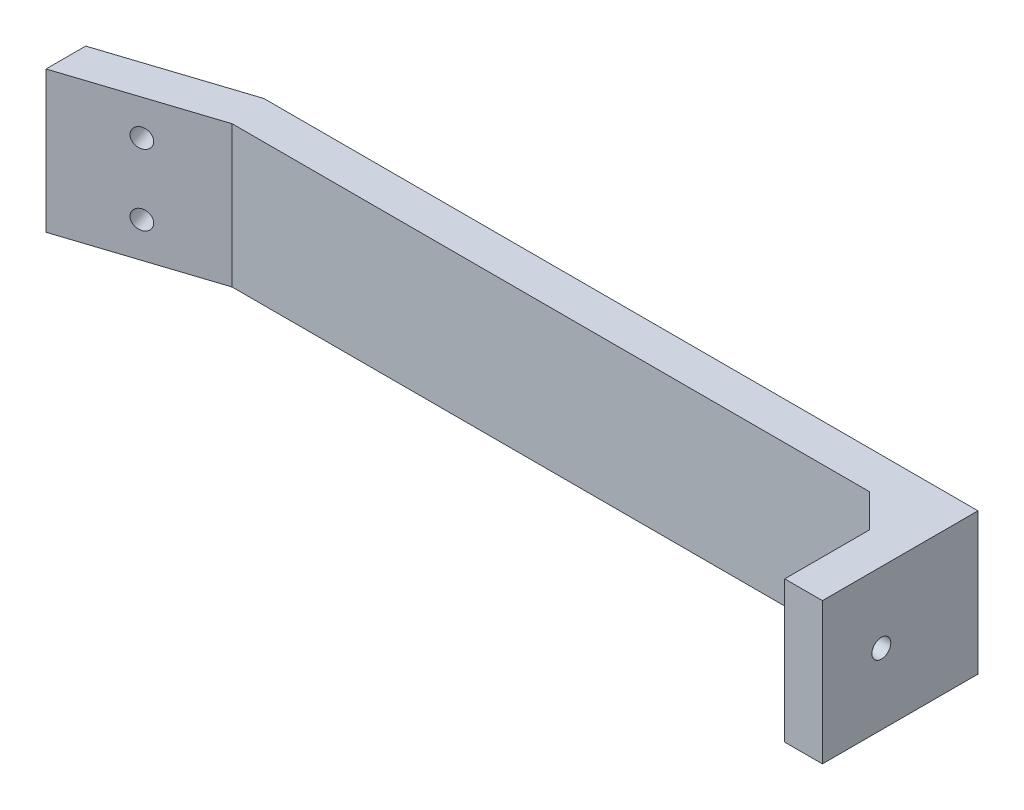
ISO-10303-21;
HEADER;
FILE_DESCRIPTION(('STEP AP214'),'2;1');
FILE_NAME('part.step','',(''),(''),'','','');
FILE_SCHEMA(('AUTOMOTIVE_DESIGN { 1 0 10303 214 1 1 1 1 }'));
ENDSEC;
DATA;
#1=APPLICATION_CONTEXT('core data for automotive mechanical design processes');
#2=APPLICATION_PROTOCOL_DEFINITION('international standard','automotive_design',2000,#1);
#3=PRODUCT_CONTEXT('',#1,'mechanical');
#4=PRODUCT('Part','Part','',(#3));
#5=PRODUCT_RELATED_PRODUCT_CATEGORY('part','',(#4));
#6=PRODUCT_DEFINITION_FORMATION('','',#4);
#7=PRODUCT_DEFINITION_CONTEXT('part definition',#1,'design');
#8=PRODUCT_DEFINITION('design','',#6,#7);
#9=PRODUCT_DEFINITION_SHAPE('','',#8);
#10=(LENGTH_UNIT() NAMED_UNIT(*) SI_UNIT(.MILLI.,.METRE.));
#11=(NAMED_UNIT(*) PLANE_ANGLE_UNIT() SI_UNIT($,.RADIAN.));
#12=(NAMED_UNIT(*) SI_UNIT($,.STERADIAN.) SOLID_ANGLE_UNIT());
#13=UNCERTAINTY_MEASURE_WITH_UNIT(LENGTH_MEASURE(1.E-05),#10,'distance_accuracy_value','');
#14=(GEOMETRIC_REPRESENTATION_CONTEXT(3) GLOBAL_UNCERTAINTY_ASSIGNED_CONTEXT((#13)) GLOBAL_UNIT_ASSIGNED_CONTEXT((#10,
#11,#12)) REPRESENTATION_CONTEXT('',''));
#15=CARTESIAN_POINT('',(0.,0.,0.));
#16=DIRECTION('',(0.,0.,1.));
#17=DIRECTION('',(1.,0.,0.));
#18=AXIS2_PLACEMENT_3D('',#15,#16,#17);
#19=CARTESIAN_POINT('',(90.,15.,8.00000000000001));
#20=DIRECTION('',(0.,0.,-1.));
#21=DIRECTION('',(-1.,0.,0.));
#22=AXIS2_PLACEMENT_3D('',#19,#20,#21);
#23=PLANE('',#22);
#24=DIRECTION('',(1.,0.,0.));
#25=VECTOR('',#24,1.);
#26=CARTESIAN_POINT('',(75.,10.,8.00000000000001));
#27=LINE('',#26,#25);
#28=CARTESIAN_POINT('',(75.,10.,8.00000000000001));
#29=VERTEX_POINT('',#28);
#30=CARTESIAN_POINT('',(82.,10.,7.99999999999999));
#31=VERTEX_POINT('',#30);
#32=EDGE_CURVE('E215',#29,#31,#27,.T.);
#33=ORIENTED_EDGE('',*,*,#32,.F.);
#34=DIRECTION('',(0.,-1.,0.));
#35=VECTOR('',#34,1.);
#36=CARTESIAN_POINT('',(75.,15.,8.00000000000001));
#37=LINE('',#36,#35);
#38=CARTESIAN_POINT('',(75.,15.,8.00000000000001));
#39=VERTEX_POINT('',#38);
#40=EDGE_CURVE('E127',#39,#29,#37,.T.);
#41=ORIENTED_EDGE('',*,*,#40,.F.);
#42=DIRECTION('',(1.,0.,0.));
#43=VECTOR('',#42,1.);
#44=CARTESIAN_POINT('',(90.,15.,8.00000000000001));
#45=LINE('',#44,#43);
#46=CARTESIAN_POINT('',(-60.201228988549,15.,7.99999999999999));
#47=VERTEX_POINT('',#46);
#48=EDGE_CURVE('E138',#47,#39,#45,.T.);
#49=ORIENTED_EDGE('',*,*,#48,.F.);
#50=DIRECTION('',(0.,-1.,0.));
#51=VECTOR('',#50,1.);
#52=CARTESIAN_POINT('',(-60.201228988549,15.,7.99999999999999));
#53=LINE('',#52,#51);
#54=CARTESIAN_POINT('',(-60.201228988549,-15.,7.99999999999999));
#55=VERTEX_POINT('',#54);
#56=EDGE_CURVE('E162',#47,#55,#53,.T.);
#57=ORIENTED_EDGE('',*,*,#56,.T.);
#58=DIRECTION('',(1.,0.,0.));
#59=VECTOR('',#58,1.);
#60=CARTESIAN_POINT('',(90.,-15.,8.00000000000001));
#61=LINE('',#60,#59);
#62=CARTESIAN_POINT('',(75.,-15.,8.00000000000001));
#63=VERTEX_POINT('',#62);
#64=EDGE_CURVE('E149',#55,#63,#61,.T.);
#65=ORIENTED_EDGE('',*,*,#64,.T.);
#66=DIRECTION('',(0.,-1.,0.));
#67=VECTOR('',#66,1.);
#68=CARTESIAN_POINT('',(75.,-15.,8.00000000000001));
#69=LINE('',#68,#67);
#70=CARTESIAN_POINT('',(75.,-10.,8.00000000000001));
#71=VERTEX_POINT('',#70);
#72=EDGE_CURVE('E220',#71,#63,#69,.T.);
#73=ORIENTED_EDGE('',*,*,#72,.F.);
#74=DIRECTION('',(1.,0.,0.));
#75=VECTOR('',#74,1.);
#76=CARTESIAN_POINT('',(75.,-9.99999999999999,8.00000000000001));
#77=LINE('',#76,#75);
#78=CARTESIAN_POINT('',(82.,-9.99999999999999,8.00000000000001));
#79=VERTEX_POINT('',#78);
#80=EDGE_CURVE('E222',#71,#79,#77,.T.);
#81=ORIENTED_EDGE('',*,*,#80,.T.);
#82=DIRECTION('',(0.,-1.,0.));
#83=VECTOR('',#82,1.);
#84=CARTESIAN_POINT('',(82.,15.,7.99999999999999));
#85=LINE('',#84,#83);
#86=EDGE_CURVE('E229',#31,#79,#85,.T.);
#87=ORIENTED_EDGE('',*,*,#86,.F.);
#88=EDGE_LOOP('',(#33,#41,#49,#57,#65,#73,#81,#87));
#89=FACE_BOUND('',#88,.T.);
#90=ADVANCED_FACE('F34',(#89),#23,.F.);
#91=CARTESIAN_POINT('',(82.,15.,33.));
#92=DIRECTION('',(1.,0.,0.));
#93=DIRECTION('',(0.,0.,-1.));
#94=AXIS2_PLACEMENT_3D('',#91,#92,#93);
#95=PLANE('',#94);
#96=CARTESIAN_POINT('',(82.,0.,20.5));
#97=DIRECTION('',(-1.,0.,0.));
#98=DIRECTION('',(0.,0.,1.));
#99=AXIS2_PLACEMENT_3D('',#96,#97,#98);
#100=CIRCLE('',#99,2.);
#101=CARTESIAN_POINT('',(82.,0.,22.5));
#102=VERTEX_POINT('',#101);
#103=EDGE_CURVE('E192',#102,#102,#100,.T.);
#104=ORIENTED_EDGE('',*,*,#103,.F.);
#105=EDGE_LOOP('',(#104));
#106=FACE_BOUND('',#105,.T.);
#107=DIRECTION('',(0.,0.,-1.));
#108=VECTOR('',#107,1.);
#109=CARTESIAN_POINT('',(82.,-9.99999999999999,8.00000000000001));
#110=LINE('',#109,#108);
#111=CARTESIAN_POINT('',(82.,-9.99999999999999,15.));
#112=VERTEX_POINT('',#111);
#113=EDGE_CURVE('E223',#112,#79,#110,.T.);
#114=ORIENTED_EDGE('',*,*,#113,.F.);
#115=DIRECTION('',(0.,1.,0.));
#116=VECTOR('',#115,1.);
#117=CARTESIAN_POINT('',(82.,-15.,15.));
#118=LINE('',#117,#116);
#119=CARTESIAN_POINT('',(82.,-15.,15.));
#120=VERTEX_POINT('',#119);
#121=EDGE_CURVE('E219',#120,#112,#118,.T.);
#122=ORIENTED_EDGE('',*,*,#121,.F.);
#123=DIRECTION('',(0.,0.,-1.));
#124=VECTOR('',#123,1.);
#125=CARTESIAN_POINT('',(82.,-15.,33.));
#126=LINE('',#125,#124);
#127=CARTESIAN_POINT('',(82.,-15.,33.));
#128=VERTEX_POINT('',#127);
#129=EDGE_CURVE('E146',#128,#120,#126,.T.);
#130=ORIENTED_EDGE('',*,*,#129,.F.);
#131=DIRECTION('',(0.,-1.,0.));
#132=VECTOR('',#131,1.);
#133=CARTESIAN_POINT('',(82.,15.,33.));
#134=LINE('',#133,#132);
#135=CARTESIAN_POINT('',(82.,15.,33.));
#136=VERTEX_POINT('',#135);
#137=EDGE_CURVE('E144',#136,#128,#134,.T.);
#138=ORIENTED_EDGE('',*,*,#137,.F.);
#139=DIRECTION('',(0.,0.,-1.));
#140=VECTOR('',#139,1.);
#141=CARTESIAN_POINT('',(82.,15.,33.));
#142=LINE('',#141,#140);
#143=CARTESIAN_POINT('',(82.,15.,15.));
#144=VERTEX_POINT('',#143);
#145=EDGE_CURVE('E134',#136,#144,#142,.T.);
#146=ORIENTED_EDGE('',*,*,#145,.T.);
#147=DIRECTION('',(0.,1.,0.));
#148=VECTOR('',#147,1.);
#149=CARTESIAN_POINT('',(82.,15.,15.));
#150=LINE('',#149,#148);
#151=CARTESIAN_POINT('',(82.,10.,15.));
#152=VERTEX_POINT('',#151);
#153=EDGE_CURVE('E122',#152,#144,#150,.T.);
#154=ORIENTED_EDGE('',*,*,#153,.F.);
#155=DIRECTION('',(0.,0.,1.));
#156=VECTOR('',#155,1.);
#157=CARTESIAN_POINT('',(82.,10.,8.00000000000001));
#158=LINE('',#157,#156);
#159=EDGE_CURVE('E51',#31,#152,#158,.T.);
#160=ORIENTED_EDGE('',*,*,#159,.F.);
#161=ORIENTED_EDGE('',*,*,#86,.T.);
#162=EDGE_LOOP('',(#114,#122,#130,#138,#146,#154,#160,#161));
#163=FACE_BOUND('',#162,.T.);
#164=ADVANCED_FACE('F142',(#106,#163),#95,.F.);
#165=CARTESIAN_POINT('',(90.,15.,50.));
#166=DIRECTION('',(-1.,0.,0.));
#167=DIRECTION('',(0.,-1.,0.));
#168=AXIS2_PLACEMENT_3D('',#165,#166,#167);
#169=PLANE('',#168);
#170=CARTESIAN_POINT('',(90.,0.,20.5));
#171=DIRECTION('',(-1.,0.,0.));
#172=DIRECTION('',(0.,-1.,0.));
#173=AXIS2_PLACEMENT_3D('',#170,#171,#172);
#174=CIRCLE('',#173,2.);
#175=CARTESIAN_POINT('',(90.,-2.,20.5));
#176=VERTEX_POINT('',#175);
#177=EDGE_CURVE('E190',#176,#176,#174,.T.);
#178=ORIENTED_EDGE('',*,*,#177,.T.);
#179=EDGE_LOOP('',(#178));
#180=FACE_BOUND('',#179,.T.);
#181=DIRECTION('',(0.,0.,-1.));
#182=VECTOR('',#181,1.);
#183=CARTESIAN_POINT('',(90.,15.,50.));
#184=LINE('',#183,#182);
#185=CARTESIAN_POINT('',(90.,15.,33.));
#186=VERTEX_POINT('',#185);
#187=CARTESIAN_POINT('',(90.,15.,0.));
#188=VERTEX_POINT('',#187);
#189=EDGE_CURVE('E11',#186,#188,#184,.T.);
#190=ORIENTED_EDGE('',*,*,#189,.F.);
#191=DIRECTION('',(0.,1.,0.));
#192=VECTOR('',#191,1.);
#193=CARTESIAN_POINT('',(90.,15.,33.));
#194=LINE('',#193,#192);
#195=CARTESIAN_POINT('',(90.,-15.,33.));
#196=VERTEX_POINT('',#195);
#197=EDGE_CURVE('E230',#196,#186,#194,.T.);
#198=ORIENTED_EDGE('',*,*,#197,.F.);
#199=DIRECTION('',(0.,0.,-1.));
#200=VECTOR('',#199,1.);
#201=CARTESIAN_POINT('',(90.,-15.,50.));
#202=LINE('',#201,#200);
#203=CARTESIAN_POINT('',(90.,-15.,0.));
#204=VERTEX_POINT('',#203);
#205=EDGE_CURVE('E185',#196,#204,#202,.T.);
#206=ORIENTED_EDGE('',*,*,#205,.T.);
#207=DIRECTION('',(0.,1.,0.));
#208=VECTOR('',#207,1.);
#209=CARTESIAN_POINT('',(90.,15.,0.));
#210=LINE('',#209,#208);
#211=EDGE_CURVE('E175',#204,#188,#210,.T.);
#212=ORIENTED_EDGE('',*,*,#211,.T.);
#213=EDGE_LOOP('',(#190,#198,#206,#212));
#214=FACE_BOUND('',#213,.T.);
#215=ADVANCED_FACE('F36',(#180,#214),#169,.F.);
#216=CARTESIAN_POINT('',(-90.,15.,50.));
#217=DIRECTION('',(0.,-1.,0.));
#218=DIRECTION('',(1.,0.,0.));
#219=AXIS2_PLACEMENT_3D('',#216,#217,#218);
#220=PLANE('',#219);
#221=ORIENTED_EDGE('',*,*,#48,.T.);
#222=DIRECTION('',(0.707106781186548,0.,0.707106781186547));
#223=VECTOR('',#222,1.);
#224=CARTESIAN_POINT('',(75.,15.,8.00000000000001));
#225=LINE('',#224,#223);
#226=EDGE_CURVE('E59',#39,#144,#225,.T.);
#227=ORIENTED_EDGE('',*,*,#226,.T.);
#228=ORIENTED_EDGE('',*,*,#145,.F.);
#229=DIRECTION('',(-1.,0.,0.));
#230=VECTOR('',#229,1.);
#231=CARTESIAN_POINT('',(90.,15.,33.));
#232=LINE('',#231,#230);
#233=EDGE_CURVE('E233',#186,#136,#232,.T.);
#234=ORIENTED_EDGE('',*,*,#233,.F.);
#235=ORIENTED_EDGE('',*,*,#189,.T.);
#236=DIRECTION('',(-1.,0.,0.));
#237=VECTOR('',#236,1.);
#238=CARTESIAN_POINT('',(-90.,15.,0.));
#239=LINE('',#238,#237);
#240=CARTESIAN_POINT('',(-61.4683045111454,15.,0.));
#241=VERTEX_POINT('',#240);
#242=EDGE_CURVE('E179',#188,#241,#239,.T.);
#243=ORIENTED_EDGE('',*,*,#242,.T.);
#244=DIRECTION('',(-0.951056516295153,0.,0.309016994374949));
#245=VECTOR('',#244,1.);
#246=CARTESIAN_POINT('',(-90.,15.,9.27050983124847));
#247=LINE('',#246,#245);
#248=CARTESIAN_POINT('',(-90.,15.,9.27050983124847));
#249=VERTEX_POINT('',#248);
#250=EDGE_CURVE('E166',#241,#249,#247,.T.);
#251=ORIENTED_EDGE('',*,*,#250,.T.);
#252=DIRECTION('',(0.,0.,-1.));
#253=VECTOR('',#252,1.);
#254=CARTESIAN_POINT('',(-90.,15.,50.));
#255=LINE('',#254,#253);
#256=CARTESIAN_POINT('',(-90.,15.,17.6822076251546));
#257=VERTEX_POINT('',#256);
#258=EDGE_CURVE('E43',#257,#249,#255,.T.);
#259=ORIENTED_EDGE('',*,*,#258,.F.);
#260=DIRECTION('',(0.951056516295153,0.,-0.309016994374949));
#261=VECTOR('',#260,1.);
#262=CARTESIAN_POINT('',(-90.,15.,17.6822076251546));
#263=LINE('',#262,#261);
#264=EDGE_CURVE('E156',#257,#47,#263,.T.);
#265=ORIENTED_EDGE('',*,*,#264,.T.);
#266=EDGE_LOOP('',(#221,#227,#228,#234,#235,#243,#251,#259,#265));
#267=FACE_BOUND('',#266,.T.);
#268=ADVANCED_FACE('F132',(#267),#220,.F.);
#269=CARTESIAN_POINT('',(-90.,15.,50.));
#270=DIRECTION('',(1.,0.,0.));
#271=DIRECTION('',(0.,1.,0.));
#272=AXIS2_PLACEMENT_3D('',#269,#270,#271);
#273=PLANE('',#272);
#274=DIRECTION('',(0.,0.,-1.));
#275=VECTOR('',#274,1.);
#276=CARTESIAN_POINT('',(-90.,-15.,50.));
#277=LINE('',#276,#275);
#278=CARTESIAN_POINT('',(-90.,-15.,17.6822076251546));
#279=VERTEX_POINT('',#278);
#280=CARTESIAN_POINT('',(-90.,-15.,9.27050983124847));
#281=VERTEX_POINT('',#280);
#282=EDGE_CURVE('E187',#279,#281,#277,.T.);
#283=ORIENTED_EDGE('',*,*,#282,.F.);
#284=DIRECTION('',(0.,-1.,0.));
#285=VECTOR('',#284,1.);
#286=CARTESIAN_POINT('',(-90.,15.,17.6822076251546));
#287=LINE('',#286,#285);
#288=EDGE_CURVE('E158',#257,#279,#287,.T.);
#289=ORIENTED_EDGE('',*,*,#288,.F.);
#290=ORIENTED_EDGE('',*,*,#258,.T.);
#291=DIRECTION('',(0.,-1.,0.));
#292=VECTOR('',#291,1.);
#293=CARTESIAN_POINT('',(-90.,15.,9.27050983124847));
#294=LINE('',#293,#292);
#295=EDGE_CURVE('E172',#249,#281,#294,.T.);
#296=ORIENTED_EDGE('',*,*,#295,.T.);
#297=EDGE_LOOP('',(#283,#289,#290,#296));
#298=FACE_BOUND('',#297,.T.);
#299=ADVANCED_FACE('F269',(#298),#273,.F.);
#300=CARTESIAN_POINT('',(-90.,-15.,50.));
#301=DIRECTION('',(0.,1.,0.));
#302=DIRECTION('',(0.,0.,1.));
#303=AXIS2_PLACEMENT_3D('',#300,#301,#302);
#304=PLANE('',#303);
#305=ORIENTED_EDGE('',*,*,#129,.T.);
#306=DIRECTION('',(0.707106781186548,0.,0.707106781186547));
#307=VECTOR('',#306,1.);
#308=CARTESIAN_POINT('',(75.,-15.,8.00000000000001));
#309=LINE('',#308,#307);
#310=EDGE_CURVE('E139',#63,#120,#309,.T.);
#311=ORIENTED_EDGE('',*,*,#310,.F.);
#312=ORIENTED_EDGE('',*,*,#64,.F.);
#313=DIRECTION('',(0.951056516295153,0.,-0.309016994374949));
#314=VECTOR('',#313,1.);
#315=CARTESIAN_POINT('',(-90.,-15.,17.6822076251546));
#316=LINE('',#315,#314);
#317=EDGE_CURVE('E145',#279,#55,#316,.T.);
#318=ORIENTED_EDGE('',*,*,#317,.F.);
#319=ORIENTED_EDGE('',*,*,#282,.T.);
#320=DIRECTION('',(-0.951056516295153,0.,0.309016994374949));
#321=VECTOR('',#320,1.);
#322=CARTESIAN_POINT('',(-90.,-15.,9.27050983124847));
#323=LINE('',#322,#321);
#324=CARTESIAN_POINT('',(-61.4683045111454,-15.,0.));
#325=VERTEX_POINT('',#324);
#326=EDGE_CURVE('E164',#325,#281,#323,.T.);
#327=ORIENTED_EDGE('',*,*,#326,.F.);
#328=DIRECTION('',(1.,0.,0.));
#329=VECTOR('',#328,1.);
#330=CARTESIAN_POINT('',(-90.,-15.,0.));
#331=LINE('',#330,#329);
#332=EDGE_CURVE('E182',#325,#204,#331,.T.);
#333=ORIENTED_EDGE('',*,*,#332,.T.);
#334=ORIENTED_EDGE('',*,*,#205,.F.);
#335=DIRECTION('',(1.,0.,0.));
#336=VECTOR('',#335,1.);
#337=CARTESIAN_POINT('',(90.,-15.,33.));
#338=LINE('',#337,#336);
#339=EDGE_CURVE('E152',#128,#196,#338,.T.);
#340=ORIENTED_EDGE('',*,*,#339,.F.);
#341=EDGE_LOOP('',(#305,#311,#312,#318,#319,#327,#333,#334,#340));
#342=FACE_BOUND('',#341,.T.);
#343=ADVANCED_FACE('F249',(#342),#304,.F.);
#344=CARTESIAN_POINT('',(0.,0.,0.));
#345=DIRECTION('',(0.,0.,1.));
#346=DIRECTION('',(1.,0.,0.));
#347=AXIS2_PLACEMENT_3D('',#344,#345,#346);
#348=PLANE('',#347);
#349=ORIENTED_EDGE('',*,*,#332,.F.);
#350=DIRECTION('',(0.,-1.,0.));
#351=VECTOR('',#350,1.);
#352=CARTESIAN_POINT('',(-61.4683045111454,15.,0.));
#353=LINE('',#352,#351);
#354=EDGE_CURVE('E169',#241,#325,#353,.T.);
#355=ORIENTED_EDGE('',*,*,#354,.F.);
#356=ORIENTED_EDGE('',*,*,#242,.F.);
#357=ORIENTED_EDGE('',*,*,#211,.F.);
#358=EDGE_LOOP('',(#349,#355,#356,#357));
#359=FACE_BOUND('',#358,.T.);
#360=ADVANCED_FACE('F260',(#359),#348,.F.);
#361=CARTESIAN_POINT('',(-90.,15.,9.27050983124847));
#362=DIRECTION('',(0.309016994374949,0.,0.951056516295153));
#363=DIRECTION('',(0.951056516295153,0.,-0.309016994374949));
#364=AXIS2_PLACEMENT_3D('',#361,#362,#363);
#365=PLANE('',#364);
#366=CARTESIAN_POINT('',(-77.1270322229585,7.5,5.08782905151615));
#367=DIRECTION('',(-0.309016994374949,0.,-0.951056516295153));
#368=DIRECTION('',(-0.951056516295153,0.,0.309016994374949));
#369=AXIS2_PLACEMENT_3D('',#366,#367,#368);
#370=CIRCLE('',#369,2.);
#371=CARTESIAN_POINT('',(-79.0291452555489,7.5,5.70586304026605));
#372=VERTEX_POINT('',#371);
#373=EDGE_CURVE('E195',#372,#372,#370,.T.);
#374=ORIENTED_EDGE('',*,*,#373,.F.);
#375=EDGE_LOOP('',(#374));
#376=FACE_BOUND('',#375,.T.);
#377=CARTESIAN_POINT('',(-77.1270322229585,-7.5,5.08782905151615));
#378=DIRECTION('',(-0.309016994374949,0.,-0.951056516295153));
#379=DIRECTION('',(-0.951056516295153,0.,0.309016994374949));
#380=AXIS2_PLACEMENT_3D('',#377,#378,#379);
#381=CIRCLE('',#380,2.);
#382=CARTESIAN_POINT('',(-79.0291452555489,-7.5,5.70586304026605));
#383=VERTEX_POINT('',#382);
#384=EDGE_CURVE('E200',#383,#383,#381,.T.);
#385=ORIENTED_EDGE('',*,*,#384,.F.);
#386=EDGE_LOOP('',(#385));
#387=FACE_BOUND('',#386,.T.);
#388=ORIENTED_EDGE('',*,*,#326,.T.);
#389=ORIENTED_EDGE('',*,*,#295,.F.);
#390=ORIENTED_EDGE('',*,*,#250,.F.);
#391=ORIENTED_EDGE('',*,*,#354,.T.);
#392=EDGE_LOOP('',(#388,#389,#390,#391));
#393=FACE_BOUND('',#392,.T.);
#394=ADVANCED_FACE('F263',(#376,#387,#393),#365,.F.);
#395=CARTESIAN_POINT('',(-90.,15.,17.6822076251546));
#396=DIRECTION('',(-0.309016994374949,0.,-0.951056516295153));
#397=DIRECTION('',(-0.951056516295153,0.,0.309016994374949));
#398=AXIS2_PLACEMENT_3D('',#395,#396,#397);
#399=PLANE('',#398);
#400=CARTESIAN_POINT('',(-74.654896267959,7.5,12.6962811818774));
#401=DIRECTION('',(-0.309016994374949,0.,-0.951056516295153));
#402=DIRECTION('',(-0.951056516295153,0.,0.309016994374949));
#403=AXIS2_PLACEMENT_3D('',#400,#401,#402);
#404=CIRCLE('',#403,2.);
#405=CARTESIAN_POINT('',(-76.5570093005493,7.5,13.3143151706273));
#406=VERTEX_POINT('',#405);
#407=EDGE_CURVE('E38',#406,#406,#404,.T.);
#408=ORIENTED_EDGE('',*,*,#407,.T.);
#409=EDGE_LOOP('',(#408));
#410=FACE_BOUND('',#409,.T.);
#411=CARTESIAN_POINT('',(-74.654896267959,-7.5,12.6962811818774));
#412=DIRECTION('',(-0.309016994374949,0.,-0.951056516295153));
#413=DIRECTION('',(-0.951056516295153,0.,0.309016994374949));
#414=AXIS2_PLACEMENT_3D('',#411,#412,#413);
#415=CIRCLE('',#414,2.);
#416=CARTESIAN_POINT('',(-76.5570093005493,-7.5,13.3143151706273));
#417=VERTEX_POINT('',#416);
#418=EDGE_CURVE('E193',#417,#417,#415,.T.);
#419=ORIENTED_EDGE('',*,*,#418,.T.);
#420=EDGE_LOOP('',(#419));
#421=FACE_BOUND('',#420,.T.);
#422=ORIENTED_EDGE('',*,*,#317,.T.);
#423=ORIENTED_EDGE('',*,*,#56,.F.);
#424=ORIENTED_EDGE('',*,*,#264,.F.);
#425=ORIENTED_EDGE('',*,*,#288,.T.);
#426=EDGE_LOOP('',(#422,#423,#424,#425));
#427=FACE_BOUND('',#426,.T.);
#428=ADVANCED_FACE('F272',(#410,#421,#427),#399,.F.);
#429=CARTESIAN_POINT('',(0.,0.,33.));
#430=DIRECTION('',(0.,0.,-1.));
#431=DIRECTION('',(-1.,0.,0.));
#432=AXIS2_PLACEMENT_3D('',#429,#430,#431);
#433=PLANE('',#432);
#434=ORIENTED_EDGE('',*,*,#197,.T.);
#435=ORIENTED_EDGE('',*,*,#233,.T.);
#436=ORIENTED_EDGE('',*,*,#137,.T.);
#437=ORIENTED_EDGE('',*,*,#339,.T.);
#438=EDGE_LOOP('',(#434,#435,#436,#437));
#439=FACE_BOUND('',#438,.T.);
#440=ADVANCED_FACE('F253',(#439),#433,.F.);
#441=CARTESIAN_POINT('',(75.,-9.99999999999999,8.00000000000001));
#442=DIRECTION('',(0.,-1.,0.));
#443=DIRECTION('',(0.,0.,-1.));
#444=AXIS2_PLACEMENT_3D('',#441,#442,#443);
#445=PLANE('',#444);
#446=ORIENTED_EDGE('',*,*,#80,.F.);
#447=DIRECTION('',(0.707106781186548,0.,0.707106781186547));
#448=VECTOR('',#447,1.);
#449=CARTESIAN_POINT('',(75.,-9.99999999999999,8.00000000000001));
#450=LINE('',#449,#448);
#451=EDGE_CURVE('E211',#71,#112,#450,.T.);
#452=ORIENTED_EDGE('',*,*,#451,.T.);
#453=ORIENTED_EDGE('',*,*,#113,.T.);
#454=EDGE_LOOP('',(#446,#452,#453));
#455=FACE_BOUND('',#454,.T.);
#456=ADVANCED_FACE('F243',(#455),#445,.F.);
#457=CARTESIAN_POINT('',(75.,10.,8.00000000000001));
#458=DIRECTION('',(0.,1.,0.));
#459=DIRECTION('',(0.,0.,1.));
#460=AXIS2_PLACEMENT_3D('',#457,#458,#459);
#461=PLANE('',#460);
#462=ORIENTED_EDGE('',*,*,#159,.T.);
#463=DIRECTION('',(-0.707106781186548,0.,-0.707106781186547));
#464=VECTOR('',#463,1.);
#465=CARTESIAN_POINT('',(75.,10.,8.00000000000001));
#466=LINE('',#465,#464);
#467=EDGE_CURVE('E125',#152,#29,#466,.T.);
#468=ORIENTED_EDGE('',*,*,#467,.T.);
#469=ORIENTED_EDGE('',*,*,#32,.T.);
#470=EDGE_LOOP('',(#462,#468,#469));
#471=FACE_BOUND('',#470,.T.);
#472=ADVANCED_FACE('F274',(#471),#461,.F.);
#473=CARTESIAN_POINT('',(75.,15.,8.00000000000001));
#474=DIRECTION('',(0.707106781186547,0.,-0.707106781186548));
#475=DIRECTION('',(-0.707106781186548,0.,-0.707106781186547));
#476=AXIS2_PLACEMENT_3D('',#473,#474,#475);
#477=PLANE('',#476);
#478=ORIENTED_EDGE('',*,*,#153,.T.);
#479=ORIENTED_EDGE('',*,*,#226,.F.);
#480=ORIENTED_EDGE('',*,*,#40,.T.);
#481=ORIENTED_EDGE('',*,*,#467,.F.);
#482=EDGE_LOOP('',(#478,#479,#480,#481));
#483=FACE_BOUND('',#482,.T.);
#484=ADVANCED_FACE('F123',(#483),#477,.F.);
#485=ORIENTED_EDGE('',*,*,#72,.T.);
#486=ORIENTED_EDGE('',*,*,#310,.T.);
#487=ORIENTED_EDGE('',*,*,#121,.T.);
#488=ORIENTED_EDGE('',*,*,#451,.F.);
#489=EDGE_LOOP('',(#485,#486,#487,#488));
#490=FACE_BOUND('',#489,.T.);
#491=ADVANCED_FACE('F245',(#490),#477,.F.);
#492=CARTESIAN_POINT('',(97.,0.,20.5));
#493=DIRECTION('',(-1.,0.,0.));
#494=DIRECTION('',(0.,0.,1.));
#495=AXIS2_PLACEMENT_3D('',#492,#493,#494);
#496=CYLINDRICAL_SURFACE('',#495,2.);
#497=ORIENTED_EDGE('',*,*,#103,.T.);
#498=EDGE_LOOP('',(#497));
#499=FACE_BOUND('',#498,.T.);
#500=ORIENTED_EDGE('',*,*,#177,.F.);
#501=EDGE_LOOP('',(#500));
#502=FACE_BOUND('',#501,.T.);
#503=ADVANCED_FACE('F312',(#499,#502),#496,.F.);
#504=CARTESIAN_POINT('',(-52.9646395338979,-7.5,79.4520272494013));
#505=DIRECTION('',(-0.309016994374949,0.,-0.951056516295153));
#506=DIRECTION('',(-0.951056516295153,0.,0.309016994374949));
#507=AXIS2_PLACEMENT_3D('',#504,#505,#506);
#508=CYLINDRICAL_SURFACE('',#507,2.);
#509=ORIENTED_EDGE('',*,*,#384,.T.);
#510=EDGE_LOOP('',(#509));
#511=FACE_BOUND('',#510,.T.);
#512=ORIENTED_EDGE('',*,*,#418,.F.);
#513=EDGE_LOOP('',(#512));
#514=FACE_BOUND('',#513,.T.);
#515=ADVANCED_FACE('F314',(#511,#514),#508,.F.);
#516=CARTESIAN_POINT('',(-52.9646395338979,7.5,79.4520272494013));
#517=DIRECTION('',(-0.309016994374949,0.,-0.951056516295153));
#518=DIRECTION('',(-0.951056516295153,0.,0.309016994374949));
#519=AXIS2_PLACEMENT_3D('',#516,#517,#518);
#520=CYLINDRICAL_SURFACE('',#519,2.);
#521=ORIENTED_EDGE('',*,*,#373,.T.);
#522=EDGE_LOOP('',(#521));
#523=FACE_BOUND('',#522,.T.);
#524=ORIENTED_EDGE('',*,*,#407,.F.);
#525=EDGE_LOOP('',(#524));
#526=FACE_BOUND('',#525,.T.);
#527=ADVANCED_FACE('F321',(#523,#526),#520,.F.);
#528=CLOSED_SHELL('',(#90,#164,#215,#268,#299,#343,#360,#394,#428,#440,#456,#472,#484,#491,#503,
#515,#527));
#529=MANIFOLD_SOLID_BREP('B2',#528);
#530=ADVANCED_BREP_SHAPE_REPRESENTATION('',(#18,#529),#14);
#531=SHAPE_DEFINITION_REPRESENTATION(#9,#530);
ENDSEC;
END-ISO-10303-21;
